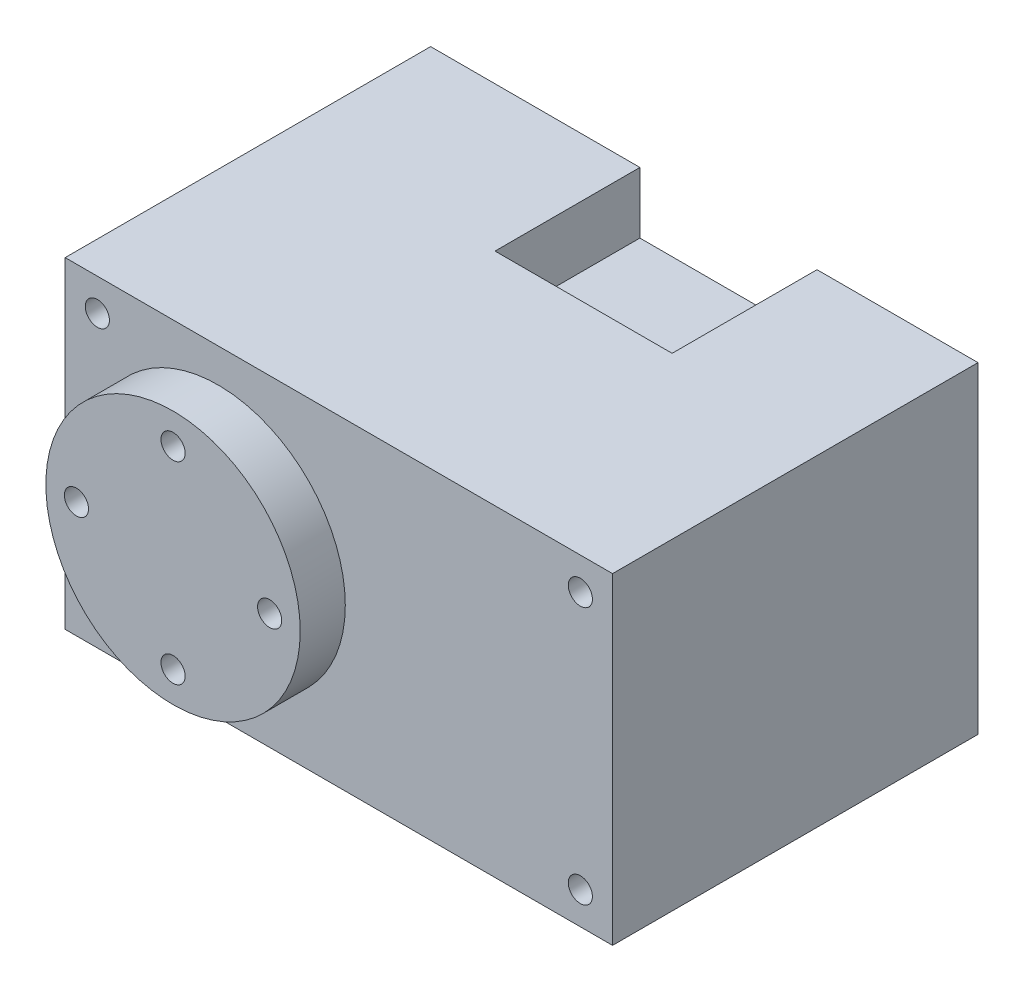
ISO-10303-21;
HEADER;
FILE_DESCRIPTION(('STEP AP214'),'2;1');
FILE_NAME('part.step','',(''),(''),'','','');
FILE_SCHEMA(('AUTOMOTIVE_DESIGN { 1 0 10303 214 1 1 1 1 }'));
ENDSEC;
DATA;
#1=APPLICATION_CONTEXT('core data for automotive mechanical design processes');
#2=APPLICATION_PROTOCOL_DEFINITION('international standard','automotive_design',2000,#1);
#3=PRODUCT_CONTEXT('',#1,'mechanical');
#4=PRODUCT('Part','Part','',(#3));
#5=PRODUCT_RELATED_PRODUCT_CATEGORY('part','',(#4));
#6=PRODUCT_DEFINITION_FORMATION('','',#4);
#7=PRODUCT_DEFINITION_CONTEXT('part definition',#1,'design');
#8=PRODUCT_DEFINITION('design','',#6,#7);
#9=PRODUCT_DEFINITION_SHAPE('','',#8);
#10=(LENGTH_UNIT() NAMED_UNIT(*) SI_UNIT(.MILLI.,.METRE.));
#11=(NAMED_UNIT(*) PLANE_ANGLE_UNIT() SI_UNIT($,.RADIAN.));
#12=(NAMED_UNIT(*) SI_UNIT($,.STERADIAN.) SOLID_ANGLE_UNIT());
#13=UNCERTAINTY_MEASURE_WITH_UNIT(LENGTH_MEASURE(1.E-05),#10,'distance_accuracy_value','');
#14=(GEOMETRIC_REPRESENTATION_CONTEXT(3) GLOBAL_UNCERTAINTY_ASSIGNED_CONTEXT((#13)) GLOBAL_UNIT_ASSIGNED_CONTEXT((#10,
#11,#12)) REPRESENTATION_CONTEXT('',''));
#15=CARTESIAN_POINT('',(0.,0.,0.));
#16=DIRECTION('',(0.,0.,1.));
#17=DIRECTION('',(1.,0.,0.));
#18=AXIS2_PLACEMENT_3D('',#15,#16,#17);
#19=CARTESIAN_POINT('',(0.,0.,11.1));
#20=DIRECTION('',(0.,0.,-1.));
#21=DIRECTION('',(-1.,0.,0.));
#22=AXIS2_PLACEMENT_3D('',#19,#20,#21);
#23=PLANE('',#22);
#24=CARTESIAN_POINT('',(-7.5,0.,11.1));
#25=DIRECTION('',(0.,0.,-1.));
#26=DIRECTION('',(-1.,0.,0.));
#27=AXIS2_PLACEMENT_3D('',#24,#25,#26);
#28=CIRCLE('',#27,1.);
#29=CARTESIAN_POINT('',(-8.5,0.,11.1));
#30=VERTEX_POINT('',#29);
#31=EDGE_CURVE('E19',#30,#30,#28,.T.);
#32=ORIENTED_EDGE('',*,*,#31,.T.);
#33=EDGE_LOOP('',(#32));
#34=FACE_BOUND('',#33,.T.);
#35=ADVANCED_FACE('F16',(#34),#23,.T.);
#36=CARTESIAN_POINT('',(-7.5,0.,3.1));
#37=DIRECTION('',(0.,0.,-1.));
#38=DIRECTION('',(-1.,0.,0.));
#39=AXIS2_PLACEMENT_3D('',#36,#37,#38);
#40=CYLINDRICAL_SURFACE('',#39,1.);
#41=ORIENTED_EDGE('',*,*,#31,.F.);
#42=EDGE_LOOP('',(#41));
#43=FACE_BOUND('',#42,.T.);
#44=CARTESIAN_POINT('',(-7.5,0.,3.1));
#45=DIRECTION('',(0.,0.,-1.));
#46=DIRECTION('',(-1.,0.,0.));
#47=AXIS2_PLACEMENT_3D('',#44,#45,#46);
#48=CIRCLE('',#47,1.);
#49=CARTESIAN_POINT('',(-8.5,0.,3.1));
#50=VERTEX_POINT('',#49);
#51=EDGE_CURVE('E223',#50,#50,#48,.F.);
#52=ORIENTED_EDGE('',*,*,#51,.F.);
#53=EDGE_LOOP('',(#52));
#54=FACE_BOUND('',#53,.T.);
#55=ADVANCED_FACE('F231',(#43,#54),#40,.F.);
#56=CARTESIAN_POINT('',(0.,0.,19.5));
#57=DIRECTION('',(0.,0.,1.));
#58=DIRECTION('',(1.,0.,0.));
#59=AXIS2_PLACEMENT_3D('',#56,#57,#58);
#60=PLANE('',#59);
#61=CARTESIAN_POINT('',(-7.5,6.,19.5));
#62=DIRECTION('',(0.,0.,1.));
#63=DIRECTION('',(1.,0.,0.));
#64=AXIS2_PLACEMENT_3D('',#61,#62,#63);
#65=CIRCLE('',#64,0.75);
#66=CARTESIAN_POINT('',(-6.75,6.,19.5));
#67=VERTEX_POINT('',#66);
#68=EDGE_CURVE('E221',#67,#67,#65,.T.);
#69=ORIENTED_EDGE('',*,*,#68,.T.);
#70=EDGE_LOOP('',(#69));
#71=FACE_BOUND('',#70,.T.);
#72=ADVANCED_FACE('F234',(#71),#60,.T.);
#73=CARTESIAN_POINT('',(-7.5,7.5,19.5));
#74=DIRECTION('',(0.,0.,1.));
#75=DIRECTION('',(1.,0.,0.));
#76=AXIS2_PLACEMENT_3D('',#73,#74,#75);
#77=PLANE('',#76);
#78=CARTESIAN_POINT('',(-13.5,0.,19.5));
#79=DIRECTION('',(0.,0.,1.));
#80=DIRECTION('',(1.,0.,0.));
#81=AXIS2_PLACEMENT_3D('',#78,#79,#80);
#82=CIRCLE('',#81,0.75);
#83=CARTESIAN_POINT('',(-12.75,0.,19.5));
#84=VERTEX_POINT('',#83);
#85=EDGE_CURVE('E218',#84,#84,#82,.T.);
#86=ORIENTED_EDGE('',*,*,#85,.T.);
#87=EDGE_LOOP('',(#86));
#88=FACE_BOUND('',#87,.T.);
#89=ADVANCED_FACE('F240',(#88),#77,.T.);
#90=CARTESIAN_POINT('',(-15.,0.,19.5));
#91=DIRECTION('',(0.,0.,1.));
#92=DIRECTION('',(1.,0.,0.));
#93=AXIS2_PLACEMENT_3D('',#90,#91,#92);
#94=PLANE('',#93);
#95=CARTESIAN_POINT('',(-7.5,-6.,19.5));
#96=DIRECTION('',(0.,0.,1.));
#97=DIRECTION('',(1.,0.,0.));
#98=AXIS2_PLACEMENT_3D('',#95,#96,#97);
#99=CIRCLE('',#98,0.75);
#100=CARTESIAN_POINT('',(-6.75,-6.,19.5));
#101=VERTEX_POINT('',#100);
#102=EDGE_CURVE('E215',#101,#101,#99,.T.);
#103=ORIENTED_EDGE('',*,*,#102,.T.);
#104=EDGE_LOOP('',(#103));
#105=FACE_BOUND('',#104,.T.);
#106=ADVANCED_FACE('F403',(#105),#94,.T.);
#107=CARTESIAN_POINT('',(-7.5,-7.5,19.5));
#108=DIRECTION('',(0.,0.,1.));
#109=DIRECTION('',(1.,0.,0.));
#110=AXIS2_PLACEMENT_3D('',#107,#108,#109);
#111=PLANE('',#110);
#112=CARTESIAN_POINT('',(-1.5,0.,19.5));
#113=DIRECTION('',(0.,0.,1.));
#114=DIRECTION('',(1.,0.,0.));
#115=AXIS2_PLACEMENT_3D('',#112,#113,#114);
#116=CIRCLE('',#115,0.75);
#117=CARTESIAN_POINT('',(-0.75,0.,19.5));
#118=VERTEX_POINT('',#117);
#119=EDGE_CURVE('E212',#118,#118,#116,.T.);
#120=ORIENTED_EDGE('',*,*,#119,.T.);
#121=EDGE_LOOP('',(#120));
#122=FACE_BOUND('',#121,.T.);
#123=ADVANCED_FACE('F400',(#122),#111,.T.);
#124=CARTESIAN_POINT('',(0.,0.,3.1));
#125=DIRECTION('',(0.,0.,-1.));
#126=DIRECTION('',(-1.,0.,0.));
#127=AXIS2_PLACEMENT_3D('',#124,#125,#126);
#128=PLANE('',#127);
#129=ORIENTED_EDGE('',*,*,#51,.T.);
#130=EDGE_LOOP('',(#129));
#131=FACE_BOUND('',#130,.T.);
#132=CARTESIAN_POINT('',(-7.5,0.,3.1));
#133=DIRECTION('',(0.,0.,-1.));
#134=DIRECTION('',(-1.,0.,0.));
#135=AXIS2_PLACEMENT_3D('',#132,#133,#134);
#136=CIRCLE('',#135,2.75);
#137=CARTESIAN_POINT('',(-10.25,0.,3.1));
#138=VERTEX_POINT('',#137);
#139=EDGE_CURVE('E209',#138,#138,#136,.T.);
#140=ORIENTED_EDGE('',*,*,#139,.T.);
#141=EDGE_LOOP('',(#140));
#142=FACE_BOUND('',#141,.T.);
#143=ADVANCED_FACE('F396',(#131,#142),#128,.T.);
#144=CARTESIAN_POINT('',(-7.5,6.,25.5));
#145=DIRECTION('',(0.,0.,1.));
#146=DIRECTION('',(1.,0.,0.));
#147=AXIS2_PLACEMENT_3D('',#144,#145,#146);
#148=CYLINDRICAL_SURFACE('',#147,0.75);
#149=ORIENTED_EDGE('',*,*,#68,.F.);
#150=EDGE_LOOP('',(#149));
#151=FACE_BOUND('',#150,.T.);
#152=CARTESIAN_POINT('',(-7.5,6.,25.5));
#153=DIRECTION('',(0.,0.,1.));
#154=DIRECTION('',(1.,0.,0.));
#155=AXIS2_PLACEMENT_3D('',#152,#153,#154);
#156=CIRCLE('',#155,0.75);
#157=CARTESIAN_POINT('',(-6.75,6.,25.5));
#158=VERTEX_POINT('',#157);
#159=EDGE_CURVE('E206',#158,#158,#156,.F.);
#160=ORIENTED_EDGE('',*,*,#159,.F.);
#161=EDGE_LOOP('',(#160));
#162=FACE_BOUND('',#161,.T.);
#163=ADVANCED_FACE('F392',(#151,#162),#148,.F.);
#164=CARTESIAN_POINT('',(-13.5,0.,25.5));
#165=DIRECTION('',(0.,0.,1.));
#166=DIRECTION('',(1.,0.,0.));
#167=AXIS2_PLACEMENT_3D('',#164,#165,#166);
#168=CYLINDRICAL_SURFACE('',#167,0.75);
#169=ORIENTED_EDGE('',*,*,#85,.F.);
#170=EDGE_LOOP('',(#169));
#171=FACE_BOUND('',#170,.T.);
#172=CARTESIAN_POINT('',(-13.5,0.,25.5));
#173=DIRECTION('',(0.,0.,1.));
#174=DIRECTION('',(1.,0.,0.));
#175=AXIS2_PLACEMENT_3D('',#172,#173,#174);
#176=CIRCLE('',#175,0.75);
#177=CARTESIAN_POINT('',(-12.75,0.,25.5));
#178=VERTEX_POINT('',#177);
#179=EDGE_CURVE('E203',#178,#178,#176,.F.);
#180=ORIENTED_EDGE('',*,*,#179,.F.);
#181=EDGE_LOOP('',(#180));
#182=FACE_BOUND('',#181,.T.);
#183=ADVANCED_FACE('F388',(#171,#182),#168,.F.);
#184=CARTESIAN_POINT('',(-7.5,-6.,25.5));
#185=DIRECTION('',(0.,0.,1.));
#186=DIRECTION('',(1.,0.,0.));
#187=AXIS2_PLACEMENT_3D('',#184,#185,#186);
#188=CYLINDRICAL_SURFACE('',#187,0.75);
#189=ORIENTED_EDGE('',*,*,#102,.F.);
#190=EDGE_LOOP('',(#189));
#191=FACE_BOUND('',#190,.T.);
#192=CARTESIAN_POINT('',(-7.5,-6.,25.5));
#193=DIRECTION('',(0.,0.,1.));
#194=DIRECTION('',(1.,0.,0.));
#195=AXIS2_PLACEMENT_3D('',#192,#193,#194);
#196=CIRCLE('',#195,0.75);
#197=CARTESIAN_POINT('',(-6.75,-6.,25.5));
#198=VERTEX_POINT('',#197);
#199=EDGE_CURVE('E200',#198,#198,#196,.F.);
#200=ORIENTED_EDGE('',*,*,#199,.F.);
#201=EDGE_LOOP('',(#200));
#202=FACE_BOUND('',#201,.T.);
#203=ADVANCED_FACE('F384',(#191,#202),#188,.F.);
#204=CARTESIAN_POINT('',(-1.5,0.,25.5));
#205=DIRECTION('',(0.,0.,1.));
#206=DIRECTION('',(1.,0.,0.));
#207=AXIS2_PLACEMENT_3D('',#204,#205,#206);
#208=CYLINDRICAL_SURFACE('',#207,0.75);
#209=ORIENTED_EDGE('',*,*,#119,.F.);
#210=EDGE_LOOP('',(#209));
#211=FACE_BOUND('',#210,.T.);
#212=CARTESIAN_POINT('',(-1.5,0.,25.5));
#213=DIRECTION('',(0.,0.,1.));
#214=DIRECTION('',(1.,0.,0.));
#215=AXIS2_PLACEMENT_3D('',#212,#213,#214);
#216=CIRCLE('',#215,0.75);
#217=CARTESIAN_POINT('',(-0.75,0.,25.5));
#218=VERTEX_POINT('',#217);
#219=EDGE_CURVE('E197',#218,#218,#216,.F.);
#220=ORIENTED_EDGE('',*,*,#219,.F.);
#221=EDGE_LOOP('',(#220));
#222=FACE_BOUND('',#221,.T.);
#223=ADVANCED_FACE('F380',(#211,#222),#208,.F.);
#224=CARTESIAN_POINT('',(-7.5,0.,1.1));
#225=DIRECTION('',(0.,0.,-1.));
#226=DIRECTION('',(-1.,0.,0.));
#227=AXIS2_PLACEMENT_3D('',#224,#225,#226);
#228=CYLINDRICAL_SURFACE('',#227,2.75);
#229=ORIENTED_EDGE('',*,*,#139,.F.);
#230=EDGE_LOOP('',(#229));
#231=FACE_BOUND('',#230,.T.);
#232=CARTESIAN_POINT('',(-7.5,0.,1.1));
#233=DIRECTION('',(0.,0.,-1.));
#234=DIRECTION('',(-1.,0.,0.));
#235=AXIS2_PLACEMENT_3D('',#232,#233,#234);
#236=CIRCLE('',#235,2.75);
#237=CARTESIAN_POINT('',(-10.25,0.,1.1));
#238=VERTEX_POINT('',#237);
#239=EDGE_CURVE('E194',#238,#238,#236,.F.);
#240=ORIENTED_EDGE('',*,*,#239,.F.);
#241=EDGE_LOOP('',(#240));
#242=FACE_BOUND('',#241,.T.);
#243=ADVANCED_FACE('F376',(#231,#242),#228,.F.);
#244=CARTESIAN_POINT('',(0.,0.,25.5));
#245=DIRECTION('',(0.,0.,1.));
#246=DIRECTION('',(1.,0.,0.));
#247=AXIS2_PLACEMENT_3D('',#244,#245,#246);
#248=PLANE('',#247);
#249=ORIENTED_EDGE('',*,*,#219,.T.);
#250=EDGE_LOOP('',(#249));
#251=FACE_BOUND('',#250,.T.);
#252=ORIENTED_EDGE('',*,*,#199,.T.);
#253=EDGE_LOOP('',(#252));
#254=FACE_BOUND('',#253,.T.);
#255=ORIENTED_EDGE('',*,*,#179,.T.);
#256=EDGE_LOOP('',(#255));
#257=FACE_BOUND('',#256,.T.);
#258=ORIENTED_EDGE('',*,*,#159,.T.);
#259=EDGE_LOOP('',(#258));
#260=FACE_BOUND('',#259,.T.);
#261=CARTESIAN_POINT('',(-7.5,0.,25.5));
#262=DIRECTION('',(0.,0.,1.));
#263=DIRECTION('',(1.,0.,0.));
#264=AXIS2_PLACEMENT_3D('',#261,#262,#263);
#265=CIRCLE('',#264,7.9);
#266=CARTESIAN_POINT('',(0.400000000000001,0.,25.5));
#267=VERTEX_POINT('',#266);
#268=EDGE_CURVE('E191',#267,#267,#265,.F.);
#269=ORIENTED_EDGE('',*,*,#268,.F.);
#270=EDGE_LOOP('',(#269));
#271=FACE_BOUND('',#270,.T.);
#272=ADVANCED_FACE('F372',(#251,#254,#257,#260,#271),#248,.T.);
#273=CARTESIAN_POINT('',(0.,0.,14.7));
#274=DIRECTION('',(0.,0.,1.));
#275=DIRECTION('',(1.,0.,0.));
#276=AXIS2_PLACEMENT_3D('',#273,#274,#275);
#277=PLANE('',#276);
#278=CARTESIAN_POINT('',(-15.,8.,14.7));
#279=DIRECTION('',(0.,0.,1.));
#280=DIRECTION('',(1.,0.,0.));
#281=AXIS2_PLACEMENT_3D('',#278,#279,#280);
#282=CIRCLE('',#281,0.75);
#283=CARTESIAN_POINT('',(-14.25,8.,14.7));
#284=VERTEX_POINT('',#283);
#285=EDGE_CURVE('E188',#284,#284,#282,.T.);
#286=ORIENTED_EDGE('',*,*,#285,.T.);
#287=EDGE_LOOP('',(#286));
#288=FACE_BOUND('',#287,.T.);
#289=ADVANCED_FACE('F368',(#288),#277,.T.);
#290=CARTESIAN_POINT('',(0.,0.,14.7));
#291=DIRECTION('',(0.,0.,1.));
#292=DIRECTION('',(1.,0.,0.));
#293=AXIS2_PLACEMENT_3D('',#290,#291,#292);
#294=PLANE('',#293);
#295=CARTESIAN_POINT('',(-15.,-8.,14.7));
#296=DIRECTION('',(0.,0.,1.));
#297=DIRECTION('',(1.,0.,0.));
#298=AXIS2_PLACEMENT_3D('',#295,#296,#297);
#299=CIRCLE('',#298,0.75);
#300=CARTESIAN_POINT('',(-14.25,-8.,14.7));
#301=VERTEX_POINT('',#300);
#302=EDGE_CURVE('E185',#301,#301,#299,.T.);
#303=ORIENTED_EDGE('',*,*,#302,.T.);
#304=EDGE_LOOP('',(#303));
#305=FACE_BOUND('',#304,.T.);
#306=ADVANCED_FACE('F364',(#305),#294,.T.);
#307=CARTESIAN_POINT('',(0.,0.,14.7));
#308=DIRECTION('',(0.,0.,1.));
#309=DIRECTION('',(1.,0.,0.));
#310=AXIS2_PLACEMENT_3D('',#307,#308,#309);
#311=PLANE('',#310);
#312=CARTESIAN_POINT('',(15.,8.,14.7));
#313=DIRECTION('',(0.,0.,1.));
#314=DIRECTION('',(1.,0.,0.));
#315=AXIS2_PLACEMENT_3D('',#312,#313,#314);
#316=CIRCLE('',#315,0.75);
#317=CARTESIAN_POINT('',(15.75,8.,14.7));
#318=VERTEX_POINT('',#317);
#319=EDGE_CURVE('E182',#318,#318,#316,.T.);
#320=ORIENTED_EDGE('',*,*,#319,.T.);
#321=EDGE_LOOP('',(#320));
#322=FACE_BOUND('',#321,.T.);
#323=ADVANCED_FACE('F360',(#322),#311,.T.);
#324=CARTESIAN_POINT('',(0.,0.,14.7));
#325=DIRECTION('',(0.,0.,1.));
#326=DIRECTION('',(1.,0.,0.));
#327=AXIS2_PLACEMENT_3D('',#324,#325,#326);
#328=PLANE('',#327);
#329=CARTESIAN_POINT('',(15.,-8.,14.7));
#330=DIRECTION('',(0.,0.,1.));
#331=DIRECTION('',(1.,0.,0.));
#332=AXIS2_PLACEMENT_3D('',#329,#330,#331);
#333=CIRCLE('',#332,0.75);
#334=CARTESIAN_POINT('',(15.75,-8.,14.7));
#335=VERTEX_POINT('',#334);
#336=EDGE_CURVE('E112',#335,#335,#333,.T.);
#337=ORIENTED_EDGE('',*,*,#336,.T.);
#338=EDGE_LOOP('',(#337));
#339=FACE_BOUND('',#338,.T.);
#340=ADVANCED_FACE('F357',(#339),#328,.T.);
#341=CARTESIAN_POINT('',(7.,-10.,9.));
#342=DIRECTION('',(0.,0.,1.));
#343=DIRECTION('',(1.,0.,0.));
#344=AXIS2_PLACEMENT_3D('',#341,#342,#343);
#345=PLANE('',#344);
#346=DIRECTION('',(1.,0.,0.));
#347=VECTOR('',#346,1.);
#348=CARTESIAN_POINT('',(0.,-6.2,9.));
#349=LINE('',#348,#347);
#350=CARTESIAN_POINT('',(7.,-6.2,9.));
#351=VERTEX_POINT('',#350);
#352=CARTESIAN_POINT('',(-4.,-6.2,9.));
#353=VERTEX_POINT('',#352);
#354=EDGE_CURVE('E102',#351,#353,#349,.F.);
#355=ORIENTED_EDGE('',*,*,#354,.F.);
#356=DIRECTION('',(0.,1.,0.));
#357=VECTOR('',#356,1.);
#358=CARTESIAN_POINT('',(7.,-10.,9.));
#359=LINE('',#358,#357);
#360=CARTESIAN_POINT('',(7.,-10.,9.));
#361=VERTEX_POINT('',#360);
#362=EDGE_CURVE('E495',#351,#361,#359,.F.);
#363=ORIENTED_EDGE('',*,*,#362,.T.);
#364=DIRECTION('',(1.,0.,0.));
#365=VECTOR('',#364,1.);
#366=CARTESIAN_POINT('',(-17.,-10.,9.));
#367=LINE('',#366,#365);
#368=CARTESIAN_POINT('',(-4.,-10.,9.));
#369=VERTEX_POINT('',#368);
#370=EDGE_CURVE('E109',#369,#361,#367,.T.);
#371=ORIENTED_EDGE('',*,*,#370,.F.);
#372=DIRECTION('',(0.,1.,0.));
#373=VECTOR('',#372,1.);
#374=CARTESIAN_POINT('',(-4.,-10.,9.));
#375=LINE('',#374,#373);
#376=EDGE_CURVE('E105',#369,#353,#375,.T.);
#377=ORIENTED_EDGE('',*,*,#376,.T.);
#378=EDGE_LOOP('',(#355,#363,#371,#377));
#379=FACE_BOUND('',#378,.T.);
#380=ADVANCED_FACE('F107',(#379),#345,.F.);
#381=CARTESIAN_POINT('',(0.,0.,6.));
#382=DIRECTION('',(0.,0.,-1.));
#383=DIRECTION('',(-1.,0.,0.));
#384=AXIS2_PLACEMENT_3D('',#381,#382,#383);
#385=PLANE('',#384);
#386=CARTESIAN_POINT('',(-15.,8.,6.));
#387=DIRECTION('',(0.,0.,-1.));
#388=DIRECTION('',(-1.,0.,0.));
#389=AXIS2_PLACEMENT_3D('',#386,#387,#388);
#390=CIRCLE('',#389,0.75);
#391=CARTESIAN_POINT('',(-15.75,8.,6.));
#392=VERTEX_POINT('',#391);
#393=EDGE_CURVE('E176',#392,#392,#390,.T.);
#394=ORIENTED_EDGE('',*,*,#393,.T.);
#395=EDGE_LOOP('',(#394));
#396=FACE_BOUND('',#395,.T.);
#397=ADVANCED_FACE('F350',(#396),#385,.T.);
#398=CARTESIAN_POINT('',(0.,0.,6.));
#399=DIRECTION('',(0.,0.,-1.));
#400=DIRECTION('',(-1.,0.,0.));
#401=AXIS2_PLACEMENT_3D('',#398,#399,#400);
#402=PLANE('',#401);
#403=CARTESIAN_POINT('',(15.,8.,6.));
#404=DIRECTION('',(0.,0.,-1.));
#405=DIRECTION('',(-1.,0.,0.));
#406=AXIS2_PLACEMENT_3D('',#403,#404,#405);
#407=CIRCLE('',#406,0.75);
#408=CARTESIAN_POINT('',(14.25,8.,6.));
#409=VERTEX_POINT('',#408);
#410=EDGE_CURVE('E173',#409,#409,#407,.T.);
#411=ORIENTED_EDGE('',*,*,#410,.T.);
#412=EDGE_LOOP('',(#411));
#413=FACE_BOUND('',#412,.T.);
#414=ADVANCED_FACE('F346',(#413),#402,.T.);
#415=CARTESIAN_POINT('',(0.,0.,6.));
#416=DIRECTION('',(0.,0.,-1.));
#417=DIRECTION('',(-1.,0.,0.));
#418=AXIS2_PLACEMENT_3D('',#415,#416,#417);
#419=PLANE('',#418);
#420=CARTESIAN_POINT('',(15.,-8.,6.));
#421=DIRECTION('',(0.,0.,-1.));
#422=DIRECTION('',(-1.,0.,0.));
#423=AXIS2_PLACEMENT_3D('',#420,#421,#422);
#424=CIRCLE('',#423,0.75);
#425=CARTESIAN_POINT('',(14.25,-8.,6.));
#426=VERTEX_POINT('',#425);
#427=EDGE_CURVE('E170',#426,#426,#424,.T.);
#428=ORIENTED_EDGE('',*,*,#427,.T.);
#429=EDGE_LOOP('',(#428));
#430=FACE_BOUND('',#429,.T.);
#431=ADVANCED_FACE('F342',(#430),#419,.T.);
#432=CARTESIAN_POINT('',(0.,0.,1.1));
#433=DIRECTION('',(0.,0.,-1.));
#434=DIRECTION('',(-1.,0.,0.));
#435=AXIS2_PLACEMENT_3D('',#432,#433,#434);
#436=PLANE('',#435);
#437=ORIENTED_EDGE('',*,*,#239,.T.);
#438=EDGE_LOOP('',(#437));
#439=FACE_BOUND('',#438,.T.);
#440=CARTESIAN_POINT('',(-7.5,0.,1.1));
#441=DIRECTION('',(0.,0.,-1.));
#442=DIRECTION('',(-1.,0.,0.));
#443=AXIS2_PLACEMENT_3D('',#440,#441,#442);
#444=CIRCLE('',#443,5.1);
#445=CARTESIAN_POINT('',(-12.6,0.,1.1));
#446=VERTEX_POINT('',#445);
#447=EDGE_CURVE('E167',#446,#446,#444,.T.);
#448=ORIENTED_EDGE('',*,*,#447,.T.);
#449=EDGE_LOOP('',(#448));
#450=FACE_BOUND('',#449,.T.);
#451=ADVANCED_FACE('F338',(#439,#450),#436,.T.);
#452=CARTESIAN_POINT('',(0.,0.,6.));
#453=DIRECTION('',(0.,0.,-1.));
#454=DIRECTION('',(-1.,0.,0.));
#455=AXIS2_PLACEMENT_3D('',#452,#453,#454);
#456=PLANE('',#455);
#457=CARTESIAN_POINT('',(-15.,-8.,6.));
#458=DIRECTION('',(0.,0.,-1.));
#459=DIRECTION('',(-1.,0.,0.));
#460=AXIS2_PLACEMENT_3D('',#457,#458,#459);
#461=CIRCLE('',#460,0.75);
#462=CARTESIAN_POINT('',(-15.75,-8.,6.));
#463=VERTEX_POINT('',#462);
#464=EDGE_CURVE('E163',#463,#463,#461,.T.);
#465=ORIENTED_EDGE('',*,*,#464,.T.);
#466=EDGE_LOOP('',(#465));
#467=FACE_BOUND('',#466,.T.);
#468=ADVANCED_FACE('F334',(#467),#456,.T.);
#469=CARTESIAN_POINT('',(-7.5,0.,22.7));
#470=DIRECTION('',(0.,0.,1.));
#471=DIRECTION('',(1.,0.,0.));
#472=AXIS2_PLACEMENT_3D('',#469,#470,#471);
#473=CYLINDRICAL_SURFACE('',#472,7.9);
#474=ORIENTED_EDGE('',*,*,#268,.T.);
#475=EDGE_LOOP('',(#474));
#476=FACE_BOUND('',#475,.T.);
#477=CARTESIAN_POINT('',(-7.5,0.,22.7));
#478=DIRECTION('',(0.,0.,1.));
#479=DIRECTION('',(1.,0.,0.));
#480=AXIS2_PLACEMENT_3D('',#477,#478,#479);
#481=CIRCLE('',#480,7.9);
#482=CARTESIAN_POINT('',(0.400000000000001,0.,22.7));
#483=VERTEX_POINT('',#482);
#484=EDGE_CURVE('E159',#483,#483,#481,.F.);
#485=ORIENTED_EDGE('',*,*,#484,.F.);
#486=EDGE_LOOP('',(#485));
#487=FACE_BOUND('',#486,.T.);
#488=ADVANCED_FACE('F330',(#476,#487),#473,.T.);
#489=CARTESIAN_POINT('',(-15.,8.,22.7));
#490=DIRECTION('',(0.,0.,1.));
#491=DIRECTION('',(1.,0.,0.));
#492=AXIS2_PLACEMENT_3D('',#489,#490,#491);
#493=CYLINDRICAL_SURFACE('',#492,0.75);
#494=ORIENTED_EDGE('',*,*,#285,.F.);
#495=EDGE_LOOP('',(#494));
#496=FACE_BOUND('',#495,.T.);
#497=CARTESIAN_POINT('',(-15.,8.,22.7));
#498=DIRECTION('',(0.,0.,1.));
#499=DIRECTION('',(1.,0.,0.));
#500=AXIS2_PLACEMENT_3D('',#497,#498,#499);
#501=CIRCLE('',#500,0.75);
#502=CARTESIAN_POINT('',(-14.25,8.,22.7));
#503=VERTEX_POINT('',#502);
#504=EDGE_CURVE('E156',#503,#503,#501,.F.);
#505=ORIENTED_EDGE('',*,*,#504,.F.);
#506=EDGE_LOOP('',(#505));
#507=FACE_BOUND('',#506,.T.);
#508=ADVANCED_FACE('F326',(#496,#507),#493,.F.);
#509=CARTESIAN_POINT('',(-15.,-8.,22.7));
#510=DIRECTION('',(0.,0.,1.));
#511=DIRECTION('',(1.,0.,0.));
#512=AXIS2_PLACEMENT_3D('',#509,#510,#511);
#513=CYLINDRICAL_SURFACE('',#512,0.75);
#514=ORIENTED_EDGE('',*,*,#302,.F.);
#515=EDGE_LOOP('',(#514));
#516=FACE_BOUND('',#515,.T.);
#517=CARTESIAN_POINT('',(-15.,-8.,22.7));
#518=DIRECTION('',(0.,0.,1.));
#519=DIRECTION('',(1.,0.,0.));
#520=AXIS2_PLACEMENT_3D('',#517,#518,#519);
#521=CIRCLE('',#520,0.75);
#522=CARTESIAN_POINT('',(-14.25,-8.,22.7));
#523=VERTEX_POINT('',#522);
#524=EDGE_CURVE('E153',#523,#523,#521,.F.);
#525=ORIENTED_EDGE('',*,*,#524,.F.);
#526=EDGE_LOOP('',(#525));
#527=FACE_BOUND('',#526,.T.);
#528=ADVANCED_FACE('F322',(#516,#527),#513,.F.);
#529=CARTESIAN_POINT('',(15.,8.,22.7));
#530=DIRECTION('',(0.,0.,1.));
#531=DIRECTION('',(1.,0.,0.));
#532=AXIS2_PLACEMENT_3D('',#529,#530,#531);
#533=CYLINDRICAL_SURFACE('',#532,0.75);
#534=ORIENTED_EDGE('',*,*,#319,.F.);
#535=EDGE_LOOP('',(#534));
#536=FACE_BOUND('',#535,.T.);
#537=CARTESIAN_POINT('',(15.,8.,22.7));
#538=DIRECTION('',(0.,0.,1.));
#539=DIRECTION('',(1.,0.,0.));
#540=AXIS2_PLACEMENT_3D('',#537,#538,#539);
#541=CIRCLE('',#540,0.75);
#542=CARTESIAN_POINT('',(15.75,8.,22.7));
#543=VERTEX_POINT('',#542);
#544=EDGE_CURVE('E150',#543,#543,#541,.F.);
#545=ORIENTED_EDGE('',*,*,#544,.F.);
#546=EDGE_LOOP('',(#545));
#547=FACE_BOUND('',#546,.T.);
#548=ADVANCED_FACE('F318',(#536,#547),#533,.F.);
#549=CARTESIAN_POINT('',(15.,-8.,22.7));
#550=DIRECTION('',(0.,0.,1.));
#551=DIRECTION('',(1.,0.,0.));
#552=AXIS2_PLACEMENT_3D('',#549,#550,#551);
#553=CYLINDRICAL_SURFACE('',#552,0.75);
#554=ORIENTED_EDGE('',*,*,#336,.F.);
#555=EDGE_LOOP('',(#554));
#556=FACE_BOUND('',#555,.T.);
#557=CARTESIAN_POINT('',(15.,-8.,22.7));
#558=DIRECTION('',(0.,0.,1.));
#559=DIRECTION('',(1.,0.,0.));
#560=AXIS2_PLACEMENT_3D('',#557,#558,#559);
#561=CIRCLE('',#560,0.75);
#562=CARTESIAN_POINT('',(15.75,-8.,22.7));
#563=VERTEX_POINT('',#562);
#564=EDGE_CURVE('E146',#563,#563,#561,.F.);
#565=ORIENTED_EDGE('',*,*,#564,.F.);
#566=EDGE_LOOP('',(#565));
#567=FACE_BOUND('',#566,.T.);
#568=ADVANCED_FACE('F315',(#556,#567),#553,.F.);
#569=CARTESIAN_POINT('',(-4.,-10.,9.));
#570=DIRECTION('',(-1.,0.,0.));
#571=DIRECTION('',(0.,0.,1.));
#572=AXIS2_PLACEMENT_3D('',#569,#570,#571);
#573=PLANE('',#572);
#574=ORIENTED_EDGE('',*,*,#376,.F.);
#575=DIRECTION('',(0.,0.,-1.));
#576=VECTOR('',#575,1.);
#577=CARTESIAN_POINT('',(-4.,-10.,0.));
#578=LINE('',#577,#576);
#579=CARTESIAN_POINT('',(-4.,-10.,0.));
#580=VERTEX_POINT('',#579);
#581=EDGE_CURVE('E493',#580,#369,#578,.F.);
#582=ORIENTED_EDGE('',*,*,#581,.F.);
#583=DIRECTION('',(0.,1.,0.));
#584=VECTOR('',#583,1.);
#585=CARTESIAN_POINT('',(-4.,0.,0.));
#586=LINE('',#585,#584);
#587=CARTESIAN_POINT('',(-4.,-6.2,0.));
#588=VERTEX_POINT('',#587);
#589=EDGE_CURVE('E118',#580,#588,#586,.T.);
#590=ORIENTED_EDGE('',*,*,#589,.T.);
#591=DIRECTION('',(0.,0.,-1.));
#592=VECTOR('',#591,1.);
#593=CARTESIAN_POINT('',(-4.,-6.2,0.));
#594=LINE('',#593,#592);
#595=EDGE_CURVE('E115',#353,#588,#594,.T.);
#596=ORIENTED_EDGE('',*,*,#595,.F.);
#597=EDGE_LOOP('',(#574,#582,#590,#596));
#598=FACE_BOUND('',#597,.T.);
#599=ADVANCED_FACE('F116',(#598),#573,.F.);
#600=CARTESIAN_POINT('',(0.,-6.2,0.));
#601=DIRECTION('',(0.,-1.,0.));
#602=DIRECTION('',(0.,0.,-1.));
#603=AXIS2_PLACEMENT_3D('',#600,#601,#602);
#604=PLANE('',#603);
#605=ORIENTED_EDGE('',*,*,#595,.T.);
#606=DIRECTION('',(1.,0.,0.));
#607=VECTOR('',#606,1.);
#608=CARTESIAN_POINT('',(0.,-6.2,0.));
#609=LINE('',#608,#607);
#610=CARTESIAN_POINT('',(7.,-6.2,0.));
#611=VERTEX_POINT('',#610);
#612=EDGE_CURVE('E461',#588,#611,#609,.T.);
#613=ORIENTED_EDGE('',*,*,#612,.T.);
#614=DIRECTION('',(0.,0.,-1.));
#615=VECTOR('',#614,1.);
#616=CARTESIAN_POINT('',(7.,-6.2,0.));
#617=LINE('',#616,#615);
#618=EDGE_CURVE('E121',#611,#351,#617,.F.);
#619=ORIENTED_EDGE('',*,*,#618,.T.);
#620=ORIENTED_EDGE('',*,*,#354,.T.);
#621=EDGE_LOOP('',(#605,#613,#619,#620));
#622=FACE_BOUND('',#621,.T.);
#623=ADVANCED_FACE('F123',(#622),#604,.T.);
#624=CARTESIAN_POINT('',(7.,-10.,0.));
#625=DIRECTION('',(1.,0.,0.));
#626=DIRECTION('',(0.,0.,-1.));
#627=AXIS2_PLACEMENT_3D('',#624,#625,#626);
#628=PLANE('',#627);
#629=ORIENTED_EDGE('',*,*,#362,.F.);
#630=ORIENTED_EDGE('',*,*,#618,.F.);
#631=DIRECTION('',(0.,1.,0.));
#632=VECTOR('',#631,1.);
#633=CARTESIAN_POINT('',(7.,0.,0.));
#634=LINE('',#633,#632);
#635=CARTESIAN_POINT('',(7.,-10.,0.));
#636=VERTEX_POINT('',#635);
#637=EDGE_CURVE('E459',#611,#636,#634,.F.);
#638=ORIENTED_EDGE('',*,*,#637,.T.);
#639=DIRECTION('',(0.,0.,-1.));
#640=VECTOR('',#639,1.);
#641=CARTESIAN_POINT('',(7.,-10.,0.));
#642=LINE('',#641,#640);
#643=EDGE_CURVE('E179',#361,#636,#642,.T.);
#644=ORIENTED_EDGE('',*,*,#643,.F.);
#645=EDGE_LOOP('',(#629,#630,#638,#644));
#646=FACE_BOUND('',#645,.T.);
#647=ADVANCED_FACE('F306',(#646),#628,.F.);
#648=CARTESIAN_POINT('',(-17.,-10.,0.));
#649=DIRECTION('',(0.,-1.,0.));
#650=DIRECTION('',(0.,0.,-1.));
#651=AXIS2_PLACEMENT_3D('',#648,#649,#650);
#652=PLANE('',#651);
#653=ORIENTED_EDGE('',*,*,#370,.T.);
#654=ORIENTED_EDGE('',*,*,#643,.T.);
#655=DIRECTION('',(1.,0.,0.));
#656=VECTOR('',#655,1.);
#657=CARTESIAN_POINT('',(0.,-10.,0.));
#658=LINE('',#657,#656);
#659=CARTESIAN_POINT('',(17.,-10.,0.));
#660=VERTEX_POINT('',#659);
#661=EDGE_CURVE('E457',#636,#660,#658,.T.);
#662=ORIENTED_EDGE('',*,*,#661,.T.);
#663=DIRECTION('',(0.,0.,-1.));
#664=VECTOR('',#663,1.);
#665=CARTESIAN_POINT('',(17.,-10.,0.));
#666=LINE('',#665,#664);
#667=CARTESIAN_POINT('',(17.,-10.,22.7));
#668=VERTEX_POINT('',#667);
#669=EDGE_CURVE('E473',#668,#660,#666,.T.);
#670=ORIENTED_EDGE('',*,*,#669,.F.);
#671=DIRECTION('',(1.,0.,0.));
#672=VECTOR('',#671,1.);
#673=CARTESIAN_POINT('',(0.,-10.,22.7));
#674=LINE('',#673,#672);
#675=CARTESIAN_POINT('',(-17.,-10.,22.7));
#676=VERTEX_POINT('',#675);
#677=EDGE_CURVE('E478',#676,#668,#674,.T.);
#678=ORIENTED_EDGE('',*,*,#677,.F.);
#679=DIRECTION('',(0.,0.,1.));
#680=VECTOR('',#679,1.);
#681=CARTESIAN_POINT('',(-17.,-10.,0.));
#682=LINE('',#681,#680);
#683=CARTESIAN_POINT('',(-17.,-10.,0.));
#684=VERTEX_POINT('',#683);
#685=EDGE_CURVE('E480',#684,#676,#682,.T.);
#686=ORIENTED_EDGE('',*,*,#685,.F.);
#687=DIRECTION('',(1.,0.,0.));
#688=VECTOR('',#687,1.);
#689=CARTESIAN_POINT('',(0.,-10.,0.));
#690=LINE('',#689,#688);
#691=EDGE_CURVE('E464',#684,#580,#690,.T.);
#692=ORIENTED_EDGE('',*,*,#691,.T.);
#693=ORIENTED_EDGE('',*,*,#581,.T.);
#694=EDGE_LOOP('',(#653,#654,#662,#670,#678,#686,#692,#693));
#695=FACE_BOUND('',#694,.T.);
#696=ADVANCED_FACE('F302',(#695),#652,.T.);
#697=CARTESIAN_POINT('',(-15.,8.,0.));
#698=DIRECTION('',(0.,0.,-1.));
#699=DIRECTION('',(-1.,0.,0.));
#700=AXIS2_PLACEMENT_3D('',#697,#698,#699);
#701=CYLINDRICAL_SURFACE('',#700,0.75);
#702=ORIENTED_EDGE('',*,*,#393,.F.);
#703=EDGE_LOOP('',(#702));
#704=FACE_BOUND('',#703,.T.);
#705=CARTESIAN_POINT('',(-15.,8.,0.));
#706=DIRECTION('',(0.,0.,-1.));
#707=DIRECTION('',(-1.,0.,0.));
#708=AXIS2_PLACEMENT_3D('',#705,#706,#707);
#709=CIRCLE('',#708,0.75);
#710=CARTESIAN_POINT('',(-15.75,8.,0.));
#711=VERTEX_POINT('',#710);
#712=EDGE_CURVE('E142',#711,#711,#709,.T.);
#713=ORIENTED_EDGE('',*,*,#712,.T.);
#714=EDGE_LOOP('',(#713));
#715=FACE_BOUND('',#714,.T.);
#716=ADVANCED_FACE('F298',(#704,#715),#701,.F.);
#717=CARTESIAN_POINT('',(15.,8.,0.));
#718=DIRECTION('',(0.,0.,-1.));
#719=DIRECTION('',(-1.,0.,0.));
#720=AXIS2_PLACEMENT_3D('',#717,#718,#719);
#721=CYLINDRICAL_SURFACE('',#720,0.75);
#722=ORIENTED_EDGE('',*,*,#410,.F.);
#723=EDGE_LOOP('',(#722));
#724=FACE_BOUND('',#723,.T.);
#725=CARTESIAN_POINT('',(15.,8.,0.));
#726=DIRECTION('',(0.,0.,-1.));
#727=DIRECTION('',(-1.,0.,0.));
#728=AXIS2_PLACEMENT_3D('',#725,#726,#727);
#729=CIRCLE('',#728,0.75);
#730=CARTESIAN_POINT('',(14.25,8.,0.));
#731=VERTEX_POINT('',#730);
#732=EDGE_CURVE('E139',#731,#731,#729,.T.);
#733=ORIENTED_EDGE('',*,*,#732,.T.);
#734=EDGE_LOOP('',(#733));
#735=FACE_BOUND('',#734,.T.);
#736=ADVANCED_FACE('F294',(#724,#735),#721,.F.);
#737=CARTESIAN_POINT('',(15.,-8.,0.));
#738=DIRECTION('',(0.,0.,-1.));
#739=DIRECTION('',(-1.,0.,0.));
#740=AXIS2_PLACEMENT_3D('',#737,#738,#739);
#741=CYLINDRICAL_SURFACE('',#740,0.75);
#742=ORIENTED_EDGE('',*,*,#427,.F.);
#743=EDGE_LOOP('',(#742));
#744=FACE_BOUND('',#743,.T.);
#745=CARTESIAN_POINT('',(15.,-8.,0.));
#746=DIRECTION('',(0.,0.,-1.));
#747=DIRECTION('',(-1.,0.,0.));
#748=AXIS2_PLACEMENT_3D('',#745,#746,#747);
#749=CIRCLE('',#748,0.75);
#750=CARTESIAN_POINT('',(14.25,-8.,0.));
#751=VERTEX_POINT('',#750);
#752=EDGE_CURVE('E136',#751,#751,#749,.T.);
#753=ORIENTED_EDGE('',*,*,#752,.T.);
#754=EDGE_LOOP('',(#753));
#755=FACE_BOUND('',#754,.T.);
#756=ADVANCED_FACE('F290',(#744,#755),#741,.F.);
#757=CARTESIAN_POINT('',(-7.5,0.,0.));
#758=DIRECTION('',(0.,0.,-1.));
#759=DIRECTION('',(-1.,0.,0.));
#760=AXIS2_PLACEMENT_3D('',#757,#758,#759);
#761=CYLINDRICAL_SURFACE('',#760,5.1);
#762=ORIENTED_EDGE('',*,*,#447,.F.);
#763=EDGE_LOOP('',(#762));
#764=FACE_BOUND('',#763,.T.);
#765=CARTESIAN_POINT('',(-7.5,0.,0.));
#766=DIRECTION('',(0.,0.,-1.));
#767=DIRECTION('',(-1.,0.,0.));
#768=AXIS2_PLACEMENT_3D('',#765,#766,#767);
#769=CIRCLE('',#768,5.1);
#770=CARTESIAN_POINT('',(-12.6,0.,0.));
#771=VERTEX_POINT('',#770);
#772=EDGE_CURVE('E133',#771,#771,#769,.T.);
#773=ORIENTED_EDGE('',*,*,#772,.T.);
#774=EDGE_LOOP('',(#773));
#775=FACE_BOUND('',#774,.T.);
#776=ADVANCED_FACE('F286',(#764,#775),#761,.F.);
#777=CARTESIAN_POINT('',(-15.,-8.,0.));
#778=DIRECTION('',(0.,0.,-1.));
#779=DIRECTION('',(-1.,0.,0.));
#780=AXIS2_PLACEMENT_3D('',#777,#778,#779);
#781=CYLINDRICAL_SURFACE('',#780,0.75);
#782=ORIENTED_EDGE('',*,*,#464,.F.);
#783=EDGE_LOOP('',(#782));
#784=FACE_BOUND('',#783,.T.);
#785=CARTESIAN_POINT('',(-15.,-8.,0.));
#786=DIRECTION('',(0.,0.,-1.));
#787=DIRECTION('',(-1.,0.,0.));
#788=AXIS2_PLACEMENT_3D('',#785,#786,#787);
#789=CIRCLE('',#788,0.75);
#790=CARTESIAN_POINT('',(-15.75,-8.,0.));
#791=VERTEX_POINT('',#790);
#792=EDGE_CURVE('E129',#791,#791,#789,.T.);
#793=ORIENTED_EDGE('',*,*,#792,.T.);
#794=EDGE_LOOP('',(#793));
#795=FACE_BOUND('',#794,.T.);
#796=ADVANCED_FACE('F282',(#784,#795),#781,.F.);
#797=CARTESIAN_POINT('',(0.,6.2,0.));
#798=DIRECTION('',(0.,-1.,0.));
#799=DIRECTION('',(0.,0.,-1.));
#800=AXIS2_PLACEMENT_3D('',#797,#798,#799);
#801=PLANE('',#800);
#802=DIRECTION('',(0.,0.,-1.));
#803=VECTOR('',#802,1.);
#804=CARTESIAN_POINT('',(-4.,6.2,9.));
#805=LINE('',#804,#803);
#806=CARTESIAN_POINT('',(-4.,6.2,9.));
#807=VERTEX_POINT('',#806);
#808=CARTESIAN_POINT('',(-4.,6.2,0.));
#809=VERTEX_POINT('',#808);
#810=EDGE_CURVE('E483',#807,#809,#805,.T.);
#811=ORIENTED_EDGE('',*,*,#810,.F.);
#812=DIRECTION('',(-1.,0.,0.));
#813=VECTOR('',#812,1.);
#814=CARTESIAN_POINT('',(7.,6.2,9.));
#815=LINE('',#814,#813);
#816=CARTESIAN_POINT('',(7.,6.2,9.));
#817=VERTEX_POINT('',#816);
#818=EDGE_CURVE('E166',#817,#807,#815,.T.);
#819=ORIENTED_EDGE('',*,*,#818,.F.);
#820=DIRECTION('',(0.,0.,1.));
#821=VECTOR('',#820,1.);
#822=CARTESIAN_POINT('',(7.,6.2,0.));
#823=LINE('',#822,#821);
#824=CARTESIAN_POINT('',(7.,6.2,0.));
#825=VERTEX_POINT('',#824);
#826=EDGE_CURVE('E450',#825,#817,#823,.T.);
#827=ORIENTED_EDGE('',*,*,#826,.F.);
#828=DIRECTION('',(1.,0.,0.));
#829=VECTOR('',#828,1.);
#830=CARTESIAN_POINT('',(0.,6.2,0.));
#831=LINE('',#830,#829);
#832=EDGE_CURVE('E471',#825,#809,#831,.F.);
#833=ORIENTED_EDGE('',*,*,#832,.T.);
#834=EDGE_LOOP('',(#811,#819,#827,#833));
#835=FACE_BOUND('',#834,.T.);
#836=ADVANCED_FACE('F278',(#835),#801,.F.);
#837=CARTESIAN_POINT('',(7.,10.,9.));
#838=DIRECTION('',(0.,0.,-1.));
#839=DIRECTION('',(-1.,0.,0.));
#840=AXIS2_PLACEMENT_3D('',#837,#838,#839);
#841=PLANE('',#840);
#842=DIRECTION('',(1.,0.,0.));
#843=VECTOR('',#842,1.);
#844=CARTESIAN_POINT('',(17.,10.,9.));
#845=LINE('',#844,#843);
#846=CARTESIAN_POINT('',(7.,10.,9.));
#847=VERTEX_POINT('',#846);
#848=CARTESIAN_POINT('',(-4.,10.,9.));
#849=VERTEX_POINT('',#848);
#850=EDGE_CURVE('E447',#847,#849,#845,.F.);
#851=ORIENTED_EDGE('',*,*,#850,.F.);
#852=DIRECTION('',(0.,1.,0.));
#853=VECTOR('',#852,1.);
#854=CARTESIAN_POINT('',(7.,10.,9.));
#855=LINE('',#854,#853);
#856=EDGE_CURVE('E132',#817,#847,#855,.T.);
#857=ORIENTED_EDGE('',*,*,#856,.F.);
#858=ORIENTED_EDGE('',*,*,#818,.T.);
#859=DIRECTION('',(0.,1.,0.));
#860=VECTOR('',#859,1.);
#861=CARTESIAN_POINT('',(-4.,10.,9.));
#862=LINE('',#861,#860);
#863=EDGE_CURVE('E486',#849,#807,#862,.F.);
#864=ORIENTED_EDGE('',*,*,#863,.F.);
#865=EDGE_LOOP('',(#851,#857,#858,#864));
#866=FACE_BOUND('',#865,.T.);
#867=ADVANCED_FACE('F274',(#866),#841,.T.);
#868=CARTESIAN_POINT('',(-4.,10.,9.));
#869=DIRECTION('',(1.,0.,0.));
#870=DIRECTION('',(0.,0.,-1.));
#871=AXIS2_PLACEMENT_3D('',#868,#869,#870);
#872=PLANE('',#871);
#873=ORIENTED_EDGE('',*,*,#863,.T.);
#874=ORIENTED_EDGE('',*,*,#810,.T.);
#875=DIRECTION('',(0.,1.,0.));
#876=VECTOR('',#875,1.);
#877=CARTESIAN_POINT('',(-4.,0.,0.));
#878=LINE('',#877,#876);
#879=CARTESIAN_POINT('',(-4.,10.,0.));
#880=VERTEX_POINT('',#879);
#881=EDGE_CURVE('E469',#809,#880,#878,.T.);
#882=ORIENTED_EDGE('',*,*,#881,.T.);
#883=DIRECTION('',(0.,0.,1.));
#884=VECTOR('',#883,1.);
#885=CARTESIAN_POINT('',(-4.,10.,0.));
#886=LINE('',#885,#884);
#887=EDGE_CURVE('E442',#849,#880,#886,.F.);
#888=ORIENTED_EDGE('',*,*,#887,.F.);
#889=EDGE_LOOP('',(#873,#874,#882,#888));
#890=FACE_BOUND('',#889,.T.);
#891=ADVANCED_FACE('F270',(#890),#872,.T.);
#892=CARTESIAN_POINT('',(-17.,10.,0.));
#893=DIRECTION('',(-1.,0.,0.));
#894=DIRECTION('',(0.,0.,1.));
#895=AXIS2_PLACEMENT_3D('',#892,#893,#894);
#896=PLANE('',#895);
#897=DIRECTION('',(0.,0.,1.));
#898=VECTOR('',#897,1.);
#899=CARTESIAN_POINT('',(-17.,10.,0.));
#900=LINE('',#899,#898);
#901=CARTESIAN_POINT('',(-17.,10.,0.));
#902=VERTEX_POINT('',#901);
#903=CARTESIAN_POINT('',(-17.,10.,22.7));
#904=VERTEX_POINT('',#903);
#905=EDGE_CURVE('E433',#902,#904,#900,.T.);
#906=ORIENTED_EDGE('',*,*,#905,.F.);
#907=DIRECTION('',(0.,1.,0.));
#908=VECTOR('',#907,1.);
#909=CARTESIAN_POINT('',(-17.,0.,0.));
#910=LINE('',#909,#908);
#911=EDGE_CURVE('E467',#902,#684,#910,.F.);
#912=ORIENTED_EDGE('',*,*,#911,.T.);
#913=ORIENTED_EDGE('',*,*,#685,.T.);
#914=DIRECTION('',(0.,1.,0.));
#915=VECTOR('',#914,1.);
#916=CARTESIAN_POINT('',(-17.,0.,22.7));
#917=LINE('',#916,#915);
#918=EDGE_CURVE('E162',#904,#676,#917,.F.);
#919=ORIENTED_EDGE('',*,*,#918,.F.);
#920=EDGE_LOOP('',(#906,#912,#913,#919));
#921=FACE_BOUND('',#920,.T.);
#922=ADVANCED_FACE('F266',(#921),#896,.T.);
#923=CARTESIAN_POINT('',(0.,0.,22.7));
#924=DIRECTION('',(0.,0.,1.));
#925=DIRECTION('',(1.,0.,0.));
#926=AXIS2_PLACEMENT_3D('',#923,#924,#925);
#927=PLANE('',#926);
#928=ORIENTED_EDGE('',*,*,#564,.T.);
#929=EDGE_LOOP('',(#928));
#930=FACE_BOUND('',#929,.T.);
#931=ORIENTED_EDGE('',*,*,#544,.T.);
#932=EDGE_LOOP('',(#931));
#933=FACE_BOUND('',#932,.T.);
#934=ORIENTED_EDGE('',*,*,#524,.T.);
#935=EDGE_LOOP('',(#934));
#936=FACE_BOUND('',#935,.T.);
#937=ORIENTED_EDGE('',*,*,#504,.T.);
#938=EDGE_LOOP('',(#937));
#939=FACE_BOUND('',#938,.T.);
#940=ORIENTED_EDGE('',*,*,#484,.T.);
#941=EDGE_LOOP('',(#940));
#942=FACE_BOUND('',#941,.T.);
#943=DIRECTION('',(1.,0.,0.));
#944=VECTOR('',#943,1.);
#945=CARTESIAN_POINT('',(17.,10.,22.7));
#946=LINE('',#945,#944);
#947=CARTESIAN_POINT('',(17.,10.,22.7));
#948=VERTEX_POINT('',#947);
#949=EDGE_CURVE('E427',#904,#948,#946,.T.);
#950=ORIENTED_EDGE('',*,*,#949,.F.);
#951=ORIENTED_EDGE('',*,*,#918,.T.);
#952=ORIENTED_EDGE('',*,*,#677,.T.);
#953=DIRECTION('',(0.,1.,0.));
#954=VECTOR('',#953,1.);
#955=CARTESIAN_POINT('',(17.,-10.,22.7));
#956=LINE('',#955,#954);
#957=EDGE_CURVE('E149',#948,#668,#956,.F.);
#958=ORIENTED_EDGE('',*,*,#957,.F.);
#959=EDGE_LOOP('',(#950,#951,#952,#958));
#960=FACE_BOUND('',#959,.T.);
#961=ADVANCED_FACE('F262',(#930,#933,#936,#939,#942,#960),#927,.T.);
#962=CARTESIAN_POINT('',(17.,-10.,0.));
#963=DIRECTION('',(1.,0.,0.));
#964=DIRECTION('',(0.,0.,-1.));
#965=AXIS2_PLACEMENT_3D('',#962,#963,#964);
#966=PLANE('',#965);
#967=ORIENTED_EDGE('',*,*,#669,.T.);
#968=DIRECTION('',(0.,1.,0.));
#969=VECTOR('',#968,1.);
#970=CARTESIAN_POINT('',(17.,0.,0.));
#971=LINE('',#970,#969);
#972=CARTESIAN_POINT('',(17.,10.,0.));
#973=VERTEX_POINT('',#972);
#974=EDGE_CURVE('E145',#660,#973,#971,.T.);
#975=ORIENTED_EDGE('',*,*,#974,.T.);
#976=DIRECTION('',(0.,0.,1.));
#977=VECTOR('',#976,1.);
#978=CARTESIAN_POINT('',(17.,10.,0.));
#979=LINE('',#978,#977);
#980=EDGE_CURVE('E432',#948,#973,#979,.F.);
#981=ORIENTED_EDGE('',*,*,#980,.F.);
#982=ORIENTED_EDGE('',*,*,#957,.T.);
#983=EDGE_LOOP('',(#967,#975,#981,#982));
#984=FACE_BOUND('',#983,.T.);
#985=ADVANCED_FACE('F258',(#984),#966,.T.);
#986=CARTESIAN_POINT('',(0.,0.,0.));
#987=DIRECTION('',(0.,0.,1.));
#988=DIRECTION('',(1.,0.,0.));
#989=AXIS2_PLACEMENT_3D('',#986,#987,#988);
#990=PLANE('',#989);
#991=ORIENTED_EDGE('',*,*,#792,.F.);
#992=EDGE_LOOP('',(#991));
#993=FACE_BOUND('',#992,.T.);
#994=ORIENTED_EDGE('',*,*,#772,.F.);
#995=EDGE_LOOP('',(#994));
#996=FACE_BOUND('',#995,.T.);
#997=ORIENTED_EDGE('',*,*,#752,.F.);
#998=EDGE_LOOP('',(#997));
#999=FACE_BOUND('',#998,.T.);
#1000=ORIENTED_EDGE('',*,*,#732,.F.);
#1001=EDGE_LOOP('',(#1000));
#1002=FACE_BOUND('',#1001,.T.);
#1003=ORIENTED_EDGE('',*,*,#712,.F.);
#1004=EDGE_LOOP('',(#1003));
#1005=FACE_BOUND('',#1004,.T.);
#1006=DIRECTION('',(1.,0.,0.));
#1007=VECTOR('',#1006,1.);
#1008=CARTESIAN_POINT('',(17.,10.,0.));
#1009=LINE('',#1008,#1007);
#1010=CARTESIAN_POINT('',(7.,10.,0.));
#1011=VERTEX_POINT('',#1010);
#1012=EDGE_CURVE('E25',#973,#1011,#1009,.F.);
#1013=ORIENTED_EDGE('',*,*,#1012,.F.);
#1014=ORIENTED_EDGE('',*,*,#974,.F.);
#1015=ORIENTED_EDGE('',*,*,#661,.F.);
#1016=ORIENTED_EDGE('',*,*,#637,.F.);
#1017=ORIENTED_EDGE('',*,*,#612,.F.);
#1018=ORIENTED_EDGE('',*,*,#589,.F.);
#1019=ORIENTED_EDGE('',*,*,#691,.F.);
#1020=ORIENTED_EDGE('',*,*,#911,.F.);
#1021=DIRECTION('',(1.,0.,0.));
#1022=VECTOR('',#1021,1.);
#1023=CARTESIAN_POINT('',(17.,10.,0.));
#1024=LINE('',#1023,#1022);
#1025=EDGE_CURVE('E439',#880,#902,#1024,.F.);
#1026=ORIENTED_EDGE('',*,*,#1025,.F.);
#1027=ORIENTED_EDGE('',*,*,#881,.F.);
#1028=ORIENTED_EDGE('',*,*,#832,.F.);
#1029=DIRECTION('',(0.,1.,0.));
#1030=VECTOR('',#1029,1.);
#1031=CARTESIAN_POINT('',(7.,10.,0.));
#1032=LINE('',#1031,#1030);
#1033=EDGE_CURVE('E34',#1011,#825,#1032,.F.);
#1034=ORIENTED_EDGE('',*,*,#1033,.F.);
#1035=EDGE_LOOP('',(#1013,#1014,#1015,#1016,#1017,#1018,#1019,#1020,#1026,#1027,#1028,#1034));
#1036=FACE_BOUND('',#1035,.T.);
#1037=ADVANCED_FACE('F251',(#993,#996,#999,#1002,#1005,#1036),#990,.F.);
#1038=CARTESIAN_POINT('',(7.,10.,0.));
#1039=DIRECTION('',(-1.,0.,0.));
#1040=DIRECTION('',(0.,0.,1.));
#1041=AXIS2_PLACEMENT_3D('',#1038,#1039,#1040);
#1042=PLANE('',#1041);
#1043=ORIENTED_EDGE('',*,*,#1033,.T.);
#1044=ORIENTED_EDGE('',*,*,#826,.T.);
#1045=ORIENTED_EDGE('',*,*,#856,.T.);
#1046=DIRECTION('',(0.,0.,1.));
#1047=VECTOR('',#1046,1.);
#1048=CARTESIAN_POINT('',(7.,10.,0.));
#1049=LINE('',#1048,#1047);
#1050=EDGE_CURVE('E11',#1011,#847,#1049,.T.);
#1051=ORIENTED_EDGE('',*,*,#1050,.F.);
#1052=EDGE_LOOP('',(#1043,#1044,#1045,#1051));
#1053=FACE_BOUND('',#1052,.T.);
#1054=ADVANCED_FACE('F245',(#1053),#1042,.T.);
#1055=CARTESIAN_POINT('',(17.,10.,0.));
#1056=DIRECTION('',(0.,1.,0.));
#1057=DIRECTION('',(0.,0.,1.));
#1058=AXIS2_PLACEMENT_3D('',#1055,#1056,#1057);
#1059=PLANE('',#1058);
#1060=ORIENTED_EDGE('',*,*,#1012,.T.);
#1061=ORIENTED_EDGE('',*,*,#1050,.T.);
#1062=ORIENTED_EDGE('',*,*,#850,.T.);
#1063=ORIENTED_EDGE('',*,*,#887,.T.);
#1064=ORIENTED_EDGE('',*,*,#1025,.T.);
#1065=ORIENTED_EDGE('',*,*,#905,.T.);
#1066=ORIENTED_EDGE('',*,*,#949,.T.);
#1067=ORIENTED_EDGE('',*,*,#980,.T.);
#1068=EDGE_LOOP('',(#1060,#1061,#1062,#1063,#1064,#1065,#1066,#1067));
#1069=FACE_BOUND('',#1068,.T.);
#1070=ADVANCED_FACE('F243',(#1069),#1059,.T.);
#1071=CLOSED_SHELL('',(#35,#55,#72,#89,#106,#123,#143,#163,#183,#203,#223,#243,#272,#289,#306,
#323,#340,#380,#397,#414,#431,#451,#468,#488,#508,#528,#548,#568,#599,#623,#647,#696,#716,#736,
#756,#776,#796,#836,#867,#891,#922,#961,#985,#1037,#1054,#1070));
#1072=MANIFOLD_SOLID_BREP('B1',#1071);
#1073=ADVANCED_BREP_SHAPE_REPRESENTATION('',(#18,#1072),#14);
#1074=SHAPE_DEFINITION_REPRESENTATION(#9,#1073);
ENDSEC;
END-ISO-10303-21;
